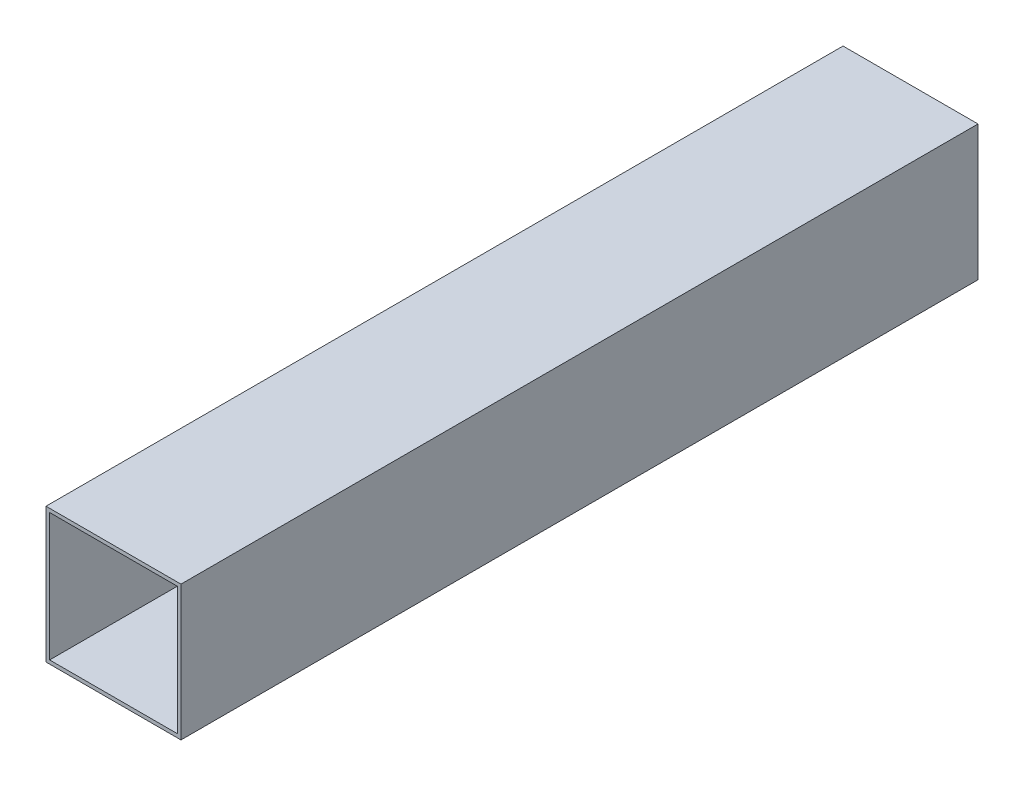
ISO-10303-21;
HEADER;
FILE_DESCRIPTION(('STEP AP214'),'2;1');
FILE_NAME('part.step','',(''),(''),'','','');
FILE_SCHEMA(('AUTOMOTIVE_DESIGN { 1 0 10303 214 1 1 1 1 }'));
ENDSEC;
DATA;
#1=APPLICATION_CONTEXT('core data for automotive mechanical design processes');
#2=APPLICATION_PROTOCOL_DEFINITION('international standard','automotive_design',2000,#1);
#3=PRODUCT_CONTEXT('',#1,'mechanical');
#4=PRODUCT('Part','Part','',(#3));
#5=PRODUCT_RELATED_PRODUCT_CATEGORY('part','',(#4));
#6=PRODUCT_DEFINITION_FORMATION('','',#4);
#7=PRODUCT_DEFINITION_CONTEXT('part definition',#1,'design');
#8=PRODUCT_DEFINITION('design','',#6,#7);
#9=PRODUCT_DEFINITION_SHAPE('','',#8);
#10=(LENGTH_UNIT() NAMED_UNIT(*) SI_UNIT(.MILLI.,.METRE.));
#11=(NAMED_UNIT(*) PLANE_ANGLE_UNIT() SI_UNIT($,.RADIAN.));
#12=(NAMED_UNIT(*) SI_UNIT($,.STERADIAN.) SOLID_ANGLE_UNIT());
#13=UNCERTAINTY_MEASURE_WITH_UNIT(LENGTH_MEASURE(1.E-05),#10,'distance_accuracy_value','');
#14=(GEOMETRIC_REPRESENTATION_CONTEXT(3) GLOBAL_UNCERTAINTY_ASSIGNED_CONTEXT((#13)) GLOBAL_UNIT_ASSIGNED_CONTEXT((#10,
#11,#12)) REPRESENTATION_CONTEXT('',''));
#15=CARTESIAN_POINT('',(0.,0.,0.));
#16=DIRECTION('',(0.,0.,1.));
#17=DIRECTION('',(1.,0.,0.));
#18=AXIS2_PLACEMENT_3D('',#15,#16,#17);
#19=CARTESIAN_POINT('',(0.,0.,300.));
#20=DIRECTION('',(0.,0.,1.));
#21=DIRECTION('',(1.,0.,0.));
#22=AXIS2_PLACEMENT_3D('',#19,#20,#21);
#23=PLANE('',#22);
#24=DIRECTION('',(0.,1.,0.));
#25=VECTOR('',#24,1.);
#26=CARTESIAN_POINT('',(25.4,-54.6,300.));
#27=LINE('',#26,#25);
#28=CARTESIAN_POINT('',(25.4,-105.4,300.));
#29=VERTEX_POINT('',#28);
#30=CARTESIAN_POINT('',(25.4,-54.6,300.));
#31=VERTEX_POINT('',#30);
#32=EDGE_CURVE('E135',#29,#31,#27,.T.);
#33=ORIENTED_EDGE('',*,*,#32,.T.);
#34=DIRECTION('',(-1.,0.,0.));
#35=VECTOR('',#34,1.);
#36=CARTESIAN_POINT('',(-25.4,-54.6,300.));
#37=LINE('',#36,#35);
#38=CARTESIAN_POINT('',(-25.4,-54.6,300.));
#39=VERTEX_POINT('',#38);
#40=EDGE_CURVE('E138',#31,#39,#37,.T.);
#41=ORIENTED_EDGE('',*,*,#40,.T.);
#42=DIRECTION('',(0.,-1.,0.));
#43=VECTOR('',#42,1.);
#44=CARTESIAN_POINT('',(-25.4,-54.6,300.));
#45=LINE('',#44,#43);
#46=CARTESIAN_POINT('',(-25.4,-105.4,300.));
#47=VERTEX_POINT('',#46);
#48=EDGE_CURVE('E141',#39,#47,#45,.T.);
#49=ORIENTED_EDGE('',*,*,#48,.T.);
#50=DIRECTION('',(1.,0.,0.));
#51=VECTOR('',#50,1.);
#52=CARTESIAN_POINT('',(-25.4,-105.4,300.));
#53=LINE('',#52,#51);
#54=EDGE_CURVE('E143',#47,#29,#53,.T.);
#55=ORIENTED_EDGE('',*,*,#54,.T.);
#56=EDGE_LOOP('',(#33,#41,#49,#55));
#57=FACE_BOUND('',#56,.T.);
#58=DIRECTION('',(0.,-1.,0.));
#59=VECTOR('',#58,1.);
#60=CARTESIAN_POINT('',(-24.0284,-55.9716,300.));
#61=LINE('',#60,#59);
#62=CARTESIAN_POINT('',(-24.0284,-55.9716,300.));
#63=VERTEX_POINT('',#62);
#64=CARTESIAN_POINT('',(-24.0284,-104.0284,300.));
#65=VERTEX_POINT('',#64);
#66=EDGE_CURVE('E107',#63,#65,#61,.T.);
#67=ORIENTED_EDGE('',*,*,#66,.F.);
#68=DIRECTION('',(-1.,0.,0.));
#69=VECTOR('',#68,1.);
#70=CARTESIAN_POINT('',(-24.0284,-55.9716,300.));
#71=LINE('',#70,#69);
#72=CARTESIAN_POINT('',(24.0284,-55.9716,300.));
#73=VERTEX_POINT('',#72);
#74=EDGE_CURVE('E99',#73,#63,#71,.T.);
#75=ORIENTED_EDGE('',*,*,#74,.F.);
#76=DIRECTION('',(0.,1.,0.));
#77=VECTOR('',#76,1.);
#78=CARTESIAN_POINT('',(24.0284,-55.9716,300.));
#79=LINE('',#78,#77);
#80=CARTESIAN_POINT('',(24.0284,-104.0284,300.));
#81=VERTEX_POINT('',#80);
#82=EDGE_CURVE('E121',#81,#73,#79,.T.);
#83=ORIENTED_EDGE('',*,*,#82,.F.);
#84=DIRECTION('',(1.,0.,0.));
#85=VECTOR('',#84,1.);
#86=CARTESIAN_POINT('',(-24.0284,-104.0284,300.));
#87=LINE('',#86,#85);
#88=EDGE_CURVE('E119',#65,#81,#87,.T.);
#89=ORIENTED_EDGE('',*,*,#88,.F.);
#90=EDGE_LOOP('',(#67,#75,#83,#89));
#91=FACE_BOUND('',#90,.T.);
#92=ADVANCED_FACE('F34',(#57,#91),#23,.T.);
#93=CARTESIAN_POINT('',(0.,0.,0.));
#94=DIRECTION('',(0.,0.,1.));
#95=DIRECTION('',(1.,0.,0.));
#96=AXIS2_PLACEMENT_3D('',#93,#94,#95);
#97=PLANE('',#96);
#98=DIRECTION('',(0.,1.,0.));
#99=VECTOR('',#98,1.);
#100=CARTESIAN_POINT('',(25.4,-54.6,0.));
#101=LINE('',#100,#99);
#102=CARTESIAN_POINT('',(25.4,-105.4,0.));
#103=VERTEX_POINT('',#102);
#104=CARTESIAN_POINT('',(25.4,-54.6,0.));
#105=VERTEX_POINT('',#104);
#106=EDGE_CURVE('E115',#103,#105,#101,.T.);
#107=ORIENTED_EDGE('',*,*,#106,.F.);
#108=DIRECTION('',(1.,0.,0.));
#109=VECTOR('',#108,1.);
#110=CARTESIAN_POINT('',(-25.4,-105.4,0.));
#111=LINE('',#110,#109);
#112=CARTESIAN_POINT('',(-25.4,-105.4,0.));
#113=VERTEX_POINT('',#112);
#114=EDGE_CURVE('E139',#113,#103,#111,.T.);
#115=ORIENTED_EDGE('',*,*,#114,.F.);
#116=DIRECTION('',(0.,-1.,0.));
#117=VECTOR('',#116,1.);
#118=CARTESIAN_POINT('',(-25.4,-54.6,0.));
#119=LINE('',#118,#117);
#120=CARTESIAN_POINT('',(-25.4,-54.6,0.));
#121=VERTEX_POINT('',#120);
#122=EDGE_CURVE('E150',#121,#113,#119,.T.);
#123=ORIENTED_EDGE('',*,*,#122,.F.);
#124=DIRECTION('',(-1.,0.,0.));
#125=VECTOR('',#124,1.);
#126=CARTESIAN_POINT('',(-25.4,-54.6,0.));
#127=LINE('',#126,#125);
#128=EDGE_CURVE('E148',#105,#121,#127,.T.);
#129=ORIENTED_EDGE('',*,*,#128,.F.);
#130=EDGE_LOOP('',(#107,#115,#123,#129));
#131=FACE_BOUND('',#130,.T.);
#132=DIRECTION('',(-1.,0.,0.));
#133=VECTOR('',#132,1.);
#134=CARTESIAN_POINT('',(-24.0284,-55.9716,0.));
#135=LINE('',#134,#133);
#136=CARTESIAN_POINT('',(24.0284,-55.9716,0.));
#137=VERTEX_POINT('',#136);
#138=CARTESIAN_POINT('',(-24.0284,-55.9716,0.));
#139=VERTEX_POINT('',#138);
#140=EDGE_CURVE('E57',#137,#139,#135,.T.);
#141=ORIENTED_EDGE('',*,*,#140,.T.);
#142=DIRECTION('',(0.,-1.,0.));
#143=VECTOR('',#142,1.);
#144=CARTESIAN_POINT('',(-24.0284,-55.9716,0.));
#145=LINE('',#144,#143);
#146=CARTESIAN_POINT('',(-24.0284,-104.0284,0.));
#147=VERTEX_POINT('',#146);
#148=EDGE_CURVE('E114',#139,#147,#145,.T.);
#149=ORIENTED_EDGE('',*,*,#148,.T.);
#150=DIRECTION('',(1.,0.,0.));
#151=VECTOR('',#150,1.);
#152=CARTESIAN_POINT('',(-24.0284,-104.0284,0.));
#153=LINE('',#152,#151);
#154=CARTESIAN_POINT('',(24.0284,-104.0284,0.));
#155=VERTEX_POINT('',#154);
#156=EDGE_CURVE('E127',#147,#155,#153,.T.);
#157=ORIENTED_EDGE('',*,*,#156,.T.);
#158=DIRECTION('',(0.,1.,0.));
#159=VECTOR('',#158,1.);
#160=CARTESIAN_POINT('',(24.0284,-55.9716,0.));
#161=LINE('',#160,#159);
#162=EDGE_CURVE('E108',#155,#137,#161,.T.);
#163=ORIENTED_EDGE('',*,*,#162,.T.);
#164=EDGE_LOOP('',(#141,#149,#157,#163));
#165=FACE_BOUND('',#164,.T.);
#166=ADVANCED_FACE('F168',(#131,#165),#97,.F.);
#167=CARTESIAN_POINT('',(25.4,-54.6,300.));
#168=DIRECTION('',(-1.,0.,0.));
#169=DIRECTION('',(0.,0.,1.));
#170=AXIS2_PLACEMENT_3D('',#167,#168,#169);
#171=PLANE('',#170);
#172=ORIENTED_EDGE('',*,*,#106,.T.);
#173=DIRECTION('',(0.,0.,-1.));
#174=VECTOR('',#173,1.);
#175=CARTESIAN_POINT('',(25.4,-54.6,300.));
#176=LINE('',#175,#174);
#177=EDGE_CURVE('E11',#31,#105,#176,.T.);
#178=ORIENTED_EDGE('',*,*,#177,.F.);
#179=ORIENTED_EDGE('',*,*,#32,.F.);
#180=DIRECTION('',(0.,0.,-1.));
#181=VECTOR('',#180,1.);
#182=CARTESIAN_POINT('',(25.4,-105.4,300.));
#183=LINE('',#182,#181);
#184=EDGE_CURVE('E145',#29,#103,#183,.T.);
#185=ORIENTED_EDGE('',*,*,#184,.T.);
#186=EDGE_LOOP('',(#172,#178,#179,#185));
#187=FACE_BOUND('',#186,.T.);
#188=ADVANCED_FACE('F36',(#187),#171,.F.);
#189=CARTESIAN_POINT('',(-25.4,-54.6,300.));
#190=DIRECTION('',(0.,-1.,0.));
#191=DIRECTION('',(0.,0.,-1.));
#192=AXIS2_PLACEMENT_3D('',#189,#190,#191);
#193=PLANE('',#192);
#194=ORIENTED_EDGE('',*,*,#128,.T.);
#195=DIRECTION('',(0.,0.,-1.));
#196=VECTOR('',#195,1.);
#197=CARTESIAN_POINT('',(-25.4,-54.6,300.));
#198=LINE('',#197,#196);
#199=EDGE_CURVE('E42',#39,#121,#198,.T.);
#200=ORIENTED_EDGE('',*,*,#199,.F.);
#201=ORIENTED_EDGE('',*,*,#40,.F.);
#202=ORIENTED_EDGE('',*,*,#177,.T.);
#203=EDGE_LOOP('',(#194,#200,#201,#202));
#204=FACE_BOUND('',#203,.T.);
#205=ADVANCED_FACE('F178',(#204),#193,.F.);
#206=CARTESIAN_POINT('',(-25.4,-54.6,300.));
#207=DIRECTION('',(1.,0.,0.));
#208=DIRECTION('',(0.,1.,0.));
#209=AXIS2_PLACEMENT_3D('',#206,#207,#208);
#210=PLANE('',#209);
#211=ORIENTED_EDGE('',*,*,#122,.T.);
#212=DIRECTION('',(0.,0.,-1.));
#213=VECTOR('',#212,1.);
#214=CARTESIAN_POINT('',(-25.4,-105.4,300.));
#215=LINE('',#214,#213);
#216=EDGE_CURVE('E155',#47,#113,#215,.T.);
#217=ORIENTED_EDGE('',*,*,#216,.F.);
#218=ORIENTED_EDGE('',*,*,#48,.F.);
#219=ORIENTED_EDGE('',*,*,#199,.T.);
#220=EDGE_LOOP('',(#211,#217,#218,#219));
#221=FACE_BOUND('',#220,.T.);
#222=ADVANCED_FACE('F162',(#221),#210,.F.);
#223=CARTESIAN_POINT('',(-25.4,-105.4,300.));
#224=DIRECTION('',(0.,1.,0.));
#225=DIRECTION('',(0.,0.,1.));
#226=AXIS2_PLACEMENT_3D('',#223,#224,#225);
#227=PLANE('',#226);
#228=ORIENTED_EDGE('',*,*,#114,.T.);
#229=ORIENTED_EDGE('',*,*,#184,.F.);
#230=ORIENTED_EDGE('',*,*,#54,.F.);
#231=ORIENTED_EDGE('',*,*,#216,.T.);
#232=EDGE_LOOP('',(#228,#229,#230,#231));
#233=FACE_BOUND('',#232,.T.);
#234=ADVANCED_FACE('F172',(#233),#227,.F.);
#235=CARTESIAN_POINT('',(-24.0284,-55.9716,300.));
#236=DIRECTION('',(0.,-1.,0.));
#237=DIRECTION('',(0.,0.,-1.));
#238=AXIS2_PLACEMENT_3D('',#235,#236,#237);
#239=PLANE('',#238);
#240=ORIENTED_EDGE('',*,*,#140,.F.);
#241=DIRECTION('',(0.,0.,-1.));
#242=VECTOR('',#241,1.);
#243=CARTESIAN_POINT('',(24.0284,-55.9716,300.));
#244=LINE('',#243,#242);
#245=EDGE_CURVE('E103',#73,#137,#244,.T.);
#246=ORIENTED_EDGE('',*,*,#245,.F.);
#247=ORIENTED_EDGE('',*,*,#74,.T.);
#248=DIRECTION('',(0.,0.,-1.));
#249=VECTOR('',#248,1.);
#250=CARTESIAN_POINT('',(-24.0284,-55.9716,300.));
#251=LINE('',#250,#249);
#252=EDGE_CURVE('E102',#63,#139,#251,.T.);
#253=ORIENTED_EDGE('',*,*,#252,.T.);
#254=EDGE_LOOP('',(#240,#246,#247,#253));
#255=FACE_BOUND('',#254,.T.);
#256=ADVANCED_FACE('F101',(#255),#239,.T.);
#257=CARTESIAN_POINT('',(-24.0284,-55.9716,300.));
#258=DIRECTION('',(1.,0.,0.));
#259=DIRECTION('',(0.,1.,0.));
#260=AXIS2_PLACEMENT_3D('',#257,#258,#259);
#261=PLANE('',#260);
#262=ORIENTED_EDGE('',*,*,#148,.F.);
#263=ORIENTED_EDGE('',*,*,#252,.F.);
#264=ORIENTED_EDGE('',*,*,#66,.T.);
#265=DIRECTION('',(0.,0.,-1.));
#266=VECTOR('',#265,1.);
#267=CARTESIAN_POINT('',(-24.0284,-104.0284,300.));
#268=LINE('',#267,#266);
#269=EDGE_CURVE('E116',#65,#147,#268,.T.);
#270=ORIENTED_EDGE('',*,*,#269,.T.);
#271=EDGE_LOOP('',(#262,#263,#264,#270));
#272=FACE_BOUND('',#271,.T.);
#273=ADVANCED_FACE('F111',(#272),#261,.T.);
#274=CARTESIAN_POINT('',(-24.0284,-104.0284,300.));
#275=DIRECTION('',(0.,1.,0.));
#276=DIRECTION('',(0.,0.,1.));
#277=AXIS2_PLACEMENT_3D('',#274,#275,#276);
#278=PLANE('',#277);
#279=ORIENTED_EDGE('',*,*,#156,.F.);
#280=ORIENTED_EDGE('',*,*,#269,.F.);
#281=ORIENTED_EDGE('',*,*,#88,.T.);
#282=DIRECTION('',(0.,0.,-1.));
#283=VECTOR('',#282,1.);
#284=CARTESIAN_POINT('',(24.0284,-104.0284,300.));
#285=LINE('',#284,#283);
#286=EDGE_CURVE('E49',#81,#155,#285,.T.);
#287=ORIENTED_EDGE('',*,*,#286,.T.);
#288=EDGE_LOOP('',(#279,#280,#281,#287));
#289=FACE_BOUND('',#288,.T.);
#290=ADVANCED_FACE('F201',(#289),#278,.T.);
#291=CARTESIAN_POINT('',(24.0284,-55.9716,300.));
#292=DIRECTION('',(-1.,0.,0.));
#293=DIRECTION('',(0.,-1.,0.));
#294=AXIS2_PLACEMENT_3D('',#291,#292,#293);
#295=PLANE('',#294);
#296=ORIENTED_EDGE('',*,*,#162,.F.);
#297=ORIENTED_EDGE('',*,*,#286,.F.);
#298=ORIENTED_EDGE('',*,*,#82,.T.);
#299=ORIENTED_EDGE('',*,*,#245,.T.);
#300=EDGE_LOOP('',(#296,#297,#298,#299));
#301=FACE_BOUND('',#300,.T.);
#302=ADVANCED_FACE('F205',(#301),#295,.T.);
#303=CLOSED_SHELL('',(#92,#166,#188,#205,#222,#234,#256,#273,#290,#302));
#304=MANIFOLD_SOLID_BREP('B2',#303);
#305=ADVANCED_BREP_SHAPE_REPRESENTATION('',(#18,#304),#14);
#306=SHAPE_DEFINITION_REPRESENTATION(#9,#305);
ENDSEC;
END-ISO-10303-21;
